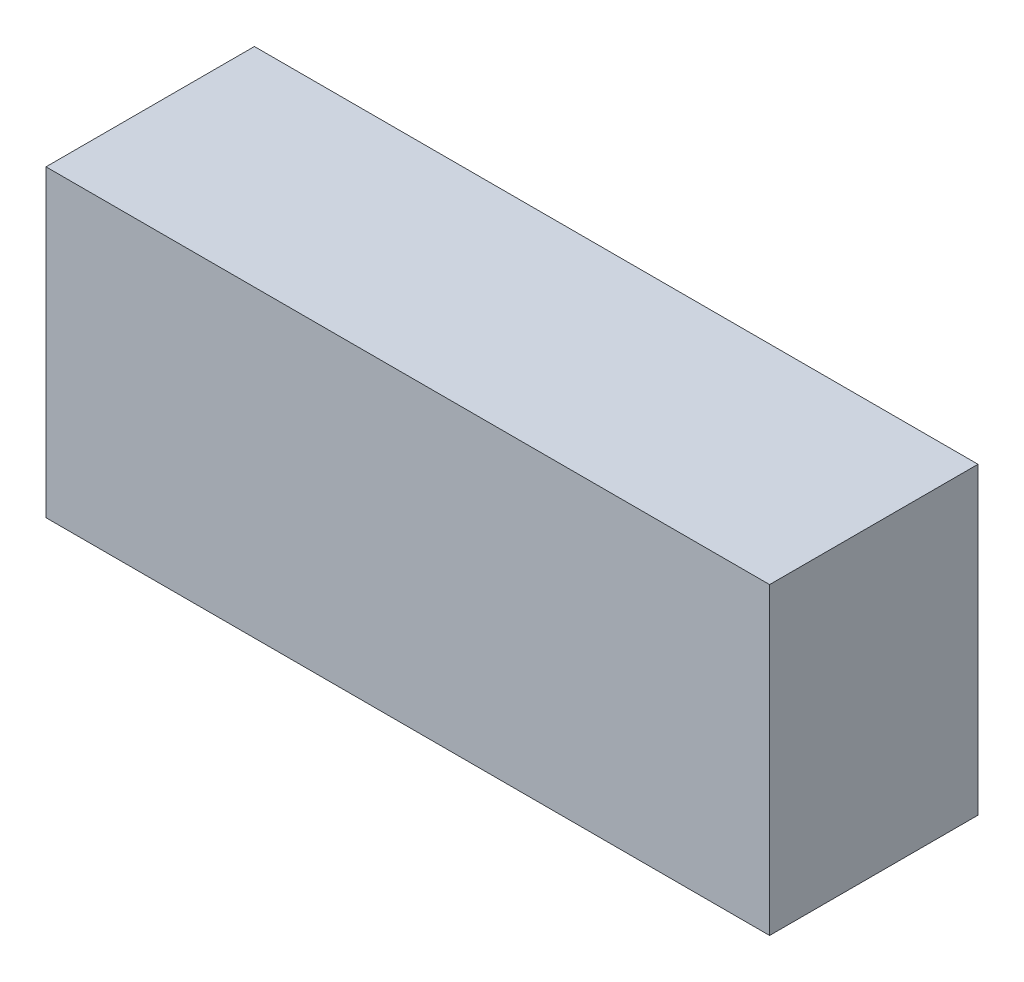
ISO-10303-21;
HEADER;
FILE_DESCRIPTION(('STEP AP214'),'2;1');
FILE_NAME('part.step','',(''),(''),'','','');
FILE_SCHEMA(('AUTOMOTIVE_DESIGN { 1 0 10303 214 1 1 1 1 }'));
ENDSEC;
DATA;
#1=APPLICATION_CONTEXT('core data for automotive mechanical design processes');
#2=APPLICATION_PROTOCOL_DEFINITION('international standard','automotive_design',2000,#1);
#3=PRODUCT_CONTEXT('',#1,'mechanical');
#4=PRODUCT('Part','Part','',(#3));
#5=PRODUCT_RELATED_PRODUCT_CATEGORY('part','',(#4));
#6=PRODUCT_DEFINITION_FORMATION('','',#4);
#7=PRODUCT_DEFINITION_CONTEXT('part definition',#1,'design');
#8=PRODUCT_DEFINITION('design','',#6,#7);
#9=PRODUCT_DEFINITION_SHAPE('','',#8);
#10=(LENGTH_UNIT() NAMED_UNIT(*) SI_UNIT(.MILLI.,.METRE.));
#11=(NAMED_UNIT(*) PLANE_ANGLE_UNIT() SI_UNIT($,.RADIAN.));
#12=(NAMED_UNIT(*) SI_UNIT($,.STERADIAN.) SOLID_ANGLE_UNIT());
#13=UNCERTAINTY_MEASURE_WITH_UNIT(LENGTH_MEASURE(1.E-05),#10,'distance_accuracy_value','');
#14=(GEOMETRIC_REPRESENTATION_CONTEXT(3) GLOBAL_UNCERTAINTY_ASSIGNED_CONTEXT((#13)) GLOBAL_UNIT_ASSIGNED_CONTEXT((#10,
#11,#12)) REPRESENTATION_CONTEXT('',''));
#15=CARTESIAN_POINT('',(0.,0.,0.));
#16=DIRECTION('',(0.,0.,1.));
#17=DIRECTION('',(1.,0.,0.));
#18=AXIS2_PLACEMENT_3D('',#15,#16,#17);
#19=CARTESIAN_POINT('',(37.5,15.75,21.6));
#20=DIRECTION('',(-1.,0.,0.));
#21=DIRECTION('',(0.,0.,1.));
#22=AXIS2_PLACEMENT_3D('',#19,#20,#21);
#23=PLANE('',#22);
#24=DIRECTION('',(0.,1.,0.));
#25=VECTOR('',#24,1.);
#26=CARTESIAN_POINT('',(37.5,15.75,0.));
#27=LINE('',#26,#25);
#28=CARTESIAN_POINT('',(37.5,-15.75,0.));
#29=VERTEX_POINT('',#28);
#30=CARTESIAN_POINT('',(37.5,15.75,0.));
#31=VERTEX_POINT('',#30);
#32=EDGE_CURVE('E99',#29,#31,#27,.T.);
#33=ORIENTED_EDGE('',*,*,#32,.T.);
#34=DIRECTION('',(0.,0.,-1.));
#35=VECTOR('',#34,1.);
#36=CARTESIAN_POINT('',(37.5,15.75,21.6));
#37=LINE('',#36,#35);
#38=CARTESIAN_POINT('',(37.5,15.75,21.6));
#39=VERTEX_POINT('',#38);
#40=EDGE_CURVE('E11',#39,#31,#37,.T.);
#41=ORIENTED_EDGE('',*,*,#40,.F.);
#42=DIRECTION('',(0.,1.,0.));
#43=VECTOR('',#42,1.);
#44=CARTESIAN_POINT('',(37.5,15.75,21.6));
#45=LINE('',#44,#43);
#46=CARTESIAN_POINT('',(37.5,-15.75,21.6));
#47=VERTEX_POINT('',#46);
#48=EDGE_CURVE('E87',#47,#39,#45,.T.);
#49=ORIENTED_EDGE('',*,*,#48,.F.);
#50=DIRECTION('',(0.,0.,-1.));
#51=VECTOR('',#50,1.);
#52=CARTESIAN_POINT('',(37.5,-15.75,21.6));
#53=LINE('',#52,#51);
#54=EDGE_CURVE('E95',#47,#29,#53,.T.);
#55=ORIENTED_EDGE('',*,*,#54,.T.);
#56=EDGE_LOOP('',(#33,#41,#49,#55));
#57=FACE_BOUND('',#56,.T.);
#58=ADVANCED_FACE('F36',(#57),#23,.F.);
#59=CARTESIAN_POINT('',(-37.5,15.75,21.6));
#60=DIRECTION('',(0.,-1.,0.));
#61=DIRECTION('',(0.,0.,-1.));
#62=AXIS2_PLACEMENT_3D('',#59,#60,#61);
#63=PLANE('',#62);
#64=DIRECTION('',(-1.,0.,0.));
#65=VECTOR('',#64,1.);
#66=CARTESIAN_POINT('',(-37.5,15.75,0.));
#67=LINE('',#66,#65);
#68=CARTESIAN_POINT('',(-37.5,15.75,0.));
#69=VERTEX_POINT('',#68);
#70=EDGE_CURVE('E91',#31,#69,#67,.T.);
#71=ORIENTED_EDGE('',*,*,#70,.T.);
#72=DIRECTION('',(0.,0.,-1.));
#73=VECTOR('',#72,1.);
#74=CARTESIAN_POINT('',(-37.5,15.75,21.6));
#75=LINE('',#74,#73);
#76=CARTESIAN_POINT('',(-37.5,15.75,21.6));
#77=VERTEX_POINT('',#76);
#78=EDGE_CURVE('E44',#77,#69,#75,.T.);
#79=ORIENTED_EDGE('',*,*,#78,.F.);
#80=DIRECTION('',(-1.,0.,0.));
#81=VECTOR('',#80,1.);
#82=CARTESIAN_POINT('',(-37.5,15.75,21.6));
#83=LINE('',#82,#81);
#84=EDGE_CURVE('E82',#39,#77,#83,.T.);
#85=ORIENTED_EDGE('',*,*,#84,.F.);
#86=ORIENTED_EDGE('',*,*,#40,.T.);
#87=EDGE_LOOP('',(#71,#79,#85,#86));
#88=FACE_BOUND('',#87,.T.);
#89=ADVANCED_FACE('F90',(#88),#63,.F.);
#90=CARTESIAN_POINT('',(-37.5,15.75,21.6));
#91=DIRECTION('',(1.,0.,0.));
#92=DIRECTION('',(0.,1.,0.));
#93=AXIS2_PLACEMENT_3D('',#90,#91,#92);
#94=PLANE('',#93);
#95=DIRECTION('',(0.,-1.,0.));
#96=VECTOR('',#95,1.);
#97=CARTESIAN_POINT('',(-37.5,15.75,0.));
#98=LINE('',#97,#96);
#99=CARTESIAN_POINT('',(-37.5,-15.75,0.));
#100=VERTEX_POINT('',#99);
#101=EDGE_CURVE('E69',#69,#100,#98,.T.);
#102=ORIENTED_EDGE('',*,*,#101,.T.);
#103=DIRECTION('',(0.,0.,-1.));
#104=VECTOR('',#103,1.);
#105=CARTESIAN_POINT('',(-37.5,-15.75,21.6));
#106=LINE('',#105,#104);
#107=CARTESIAN_POINT('',(-37.5,-15.75,21.6));
#108=VERTEX_POINT('',#107);
#109=EDGE_CURVE('E92',#108,#100,#106,.T.);
#110=ORIENTED_EDGE('',*,*,#109,.F.);
#111=DIRECTION('',(0.,-1.,0.));
#112=VECTOR('',#111,1.);
#113=CARTESIAN_POINT('',(-37.5,15.75,21.6));
#114=LINE('',#113,#112);
#115=EDGE_CURVE('E85',#77,#108,#114,.T.);
#116=ORIENTED_EDGE('',*,*,#115,.F.);
#117=ORIENTED_EDGE('',*,*,#78,.T.);
#118=EDGE_LOOP('',(#102,#110,#116,#117));
#119=FACE_BOUND('',#118,.T.);
#120=ADVANCED_FACE('F93',(#119),#94,.F.);
#121=CARTESIAN_POINT('',(-37.5,-15.75,21.6));
#122=DIRECTION('',(0.,1.,0.));
#123=DIRECTION('',(0.,0.,1.));
#124=AXIS2_PLACEMENT_3D('',#121,#122,#123);
#125=PLANE('',#124);
#126=DIRECTION('',(1.,0.,0.));
#127=VECTOR('',#126,1.);
#128=CARTESIAN_POINT('',(-37.5,-15.75,0.));
#129=LINE('',#128,#127);
#130=EDGE_CURVE('E75',#100,#29,#129,.T.);
#131=ORIENTED_EDGE('',*,*,#130,.T.);
#132=ORIENTED_EDGE('',*,*,#54,.F.);
#133=DIRECTION('',(1.,0.,0.));
#134=VECTOR('',#133,1.);
#135=CARTESIAN_POINT('',(-37.5,-15.75,21.6));
#136=LINE('',#135,#134);
#137=EDGE_CURVE('E52',#108,#47,#136,.T.);
#138=ORIENTED_EDGE('',*,*,#137,.F.);
#139=ORIENTED_EDGE('',*,*,#109,.T.);
#140=EDGE_LOOP('',(#131,#132,#138,#139));
#141=FACE_BOUND('',#140,.T.);
#142=ADVANCED_FACE('F106',(#141),#125,.F.);
#143=CARTESIAN_POINT('',(0.,0.,21.6));
#144=DIRECTION('',(0.,0.,1.));
#145=DIRECTION('',(1.,0.,0.));
#146=AXIS2_PLACEMENT_3D('',#143,#144,#145);
#147=PLANE('',#146);
#148=ORIENTED_EDGE('',*,*,#48,.T.);
#149=ORIENTED_EDGE('',*,*,#84,.T.);
#150=ORIENTED_EDGE('',*,*,#115,.T.);
#151=ORIENTED_EDGE('',*,*,#137,.T.);
#152=EDGE_LOOP('',(#148,#149,#150,#151));
#153=FACE_BOUND('',#152,.T.);
#154=ADVANCED_FACE('F83',(#153),#147,.T.);
#155=CARTESIAN_POINT('',(0.,0.,0.));
#156=DIRECTION('',(0.,0.,1.));
#157=DIRECTION('',(1.,0.,0.));
#158=AXIS2_PLACEMENT_3D('',#155,#156,#157);
#159=PLANE('',#158);
#160=ORIENTED_EDGE('',*,*,#32,.F.);
#161=ORIENTED_EDGE('',*,*,#130,.F.);
#162=ORIENTED_EDGE('',*,*,#101,.F.);
#163=ORIENTED_EDGE('',*,*,#70,.F.);
#164=EDGE_LOOP('',(#160,#161,#162,#163));
#165=FACE_BOUND('',#164,.T.);
#166=ADVANCED_FACE('F109',(#165),#159,.F.);
#167=CLOSED_SHELL('',(#58,#89,#120,#142,#154,#166));
#168=MANIFOLD_SOLID_BREP('B2',#167);
#169=ADVANCED_BREP_SHAPE_REPRESENTATION('',(#18,#168),#14);
#170=SHAPE_DEFINITION_REPRESENTATION(#9,#169);
ENDSEC;
END-ISO-10303-21;
